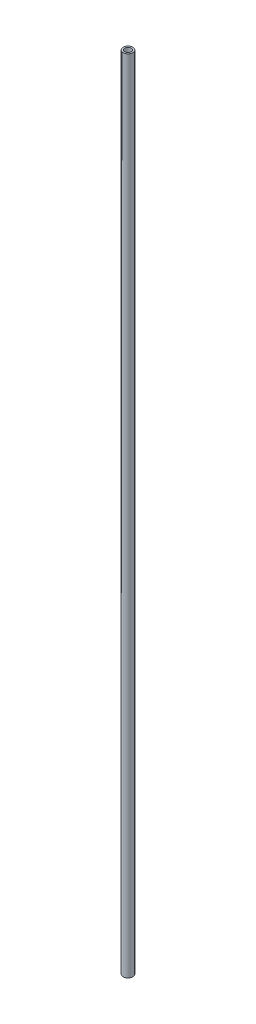
ISO-10303-21;
HEADER;
FILE_DESCRIPTION(('STEP AP214'),'2;1');
FILE_NAME('part.step','',(''),(''),'','','');
FILE_SCHEMA(('AUTOMOTIVE_DESIGN { 1 0 10303 214 1 1 1 1 }'));
ENDSEC;
DATA;
#1=APPLICATION_CONTEXT('core data for automotive mechanical design processes');
#2=APPLICATION_PROTOCOL_DEFINITION('international standard','automotive_design',2000,#1);
#3=PRODUCT_CONTEXT('',#1,'mechanical');
#4=PRODUCT('Part','Part','',(#3));
#5=PRODUCT_RELATED_PRODUCT_CATEGORY('part','',(#4));
#6=PRODUCT_DEFINITION_FORMATION('','',#4);
#7=PRODUCT_DEFINITION_CONTEXT('part definition',#1,'design');
#8=PRODUCT_DEFINITION('design','',#6,#7);
#9=PRODUCT_DEFINITION_SHAPE('','',#8);
#10=(LENGTH_UNIT() NAMED_UNIT(*) SI_UNIT(.MILLI.,.METRE.));
#11=(NAMED_UNIT(*) PLANE_ANGLE_UNIT() SI_UNIT($,.RADIAN.));
#12=(NAMED_UNIT(*) SI_UNIT($,.STERADIAN.) SOLID_ANGLE_UNIT());
#13=UNCERTAINTY_MEASURE_WITH_UNIT(LENGTH_MEASURE(1.E-05),#10,'distance_accuracy_value','');
#14=(GEOMETRIC_REPRESENTATION_CONTEXT(3) GLOBAL_UNCERTAINTY_ASSIGNED_CONTEXT((#13)) GLOBAL_UNIT_ASSIGNED_CONTEXT((#10,
#11,#12)) REPRESENTATION_CONTEXT('',''));
#15=CARTESIAN_POINT('',(0.,0.,0.));
#16=DIRECTION('',(0.,0.,1.));
#17=DIRECTION('',(1.,0.,0.));
#18=AXIS2_PLACEMENT_3D('',#15,#16,#17);
#19=CARTESIAN_POINT('',(0.,250.,0.));
#20=DIRECTION('',(0.,1.,0.));
#21=DIRECTION('',(0.,0.,1.));
#22=AXIS2_PLACEMENT_3D('',#19,#20,#21);
#23=PLANE('',#22);
#24=CARTESIAN_POINT('',(0.,250.,0.));
#25=DIRECTION('',(0.,1.,0.));
#26=DIRECTION('',(0.,0.,1.));
#27=AXIS2_PLACEMENT_3D('',#24,#25,#26);
#28=CIRCLE('',#27,3.);
#29=CARTESIAN_POINT('',(0.,250.,3.));
#30=VERTEX_POINT('',#29);
#31=EDGE_CURVE('E10',#30,#30,#28,.T.);
#32=ORIENTED_EDGE('',*,*,#31,.T.);
#33=EDGE_LOOP('',(#32));
#34=FACE_BOUND('',#33,.T.);
#35=CARTESIAN_POINT('',(0.,250.,0.));
#36=DIRECTION('',(0.,1.,0.));
#37=DIRECTION('',(0.,0.,1.));
#38=AXIS2_PLACEMENT_3D('',#35,#36,#37);
#39=CIRCLE('',#38,2.);
#40=CARTESIAN_POINT('',(0.,250.,2.));
#41=VERTEX_POINT('',#40);
#42=EDGE_CURVE('E42',#41,#41,#39,.T.);
#43=ORIENTED_EDGE('',*,*,#42,.F.);
#44=EDGE_LOOP('',(#43));
#45=FACE_BOUND('',#44,.T.);
#46=ADVANCED_FACE('F31',(#34,#45),#23,.T.);
#47=CARTESIAN_POINT('',(0.,-250.,0.));
#48=DIRECTION('',(0.,1.,0.));
#49=DIRECTION('',(0.,0.,1.));
#50=AXIS2_PLACEMENT_3D('',#47,#48,#49);
#51=PLANE('',#50);
#52=CARTESIAN_POINT('',(0.,-250.,0.));
#53=DIRECTION('',(0.,1.,0.));
#54=DIRECTION('',(0.,0.,1.));
#55=AXIS2_PLACEMENT_3D('',#52,#53,#54);
#56=CIRCLE('',#55,3.);
#57=CARTESIAN_POINT('',(0.,-250.,3.));
#58=VERTEX_POINT('',#57);
#59=EDGE_CURVE('E35',#58,#58,#56,.T.);
#60=ORIENTED_EDGE('',*,*,#59,.F.);
#61=EDGE_LOOP('',(#60));
#62=FACE_BOUND('',#61,.T.);
#63=CARTESIAN_POINT('',(0.,-250.,0.));
#64=DIRECTION('',(0.,1.,0.));
#65=DIRECTION('',(0.,0.,1.));
#66=AXIS2_PLACEMENT_3D('',#63,#64,#65);
#67=CIRCLE('',#66,2.);
#68=CARTESIAN_POINT('',(0.,-250.,2.));
#69=VERTEX_POINT('',#68);
#70=EDGE_CURVE('E44',#69,#69,#67,.T.);
#71=ORIENTED_EDGE('',*,*,#70,.T.);
#72=EDGE_LOOP('',(#71));
#73=FACE_BOUND('',#72,.T.);
#74=ADVANCED_FACE('F54',(#62,#73),#51,.F.);
#75=CARTESIAN_POINT('',(0.,250.,0.));
#76=DIRECTION('',(0.,-1.,0.));
#77=DIRECTION('',(0.,0.,-1.));
#78=AXIS2_PLACEMENT_3D('',#75,#76,#77);
#79=CYLINDRICAL_SURFACE('',#78,3.);
#80=ORIENTED_EDGE('',*,*,#31,.F.);
#81=EDGE_LOOP('',(#80));
#82=FACE_BOUND('',#81,.T.);
#83=ORIENTED_EDGE('',*,*,#59,.T.);
#84=EDGE_LOOP('',(#83));
#85=FACE_BOUND('',#84,.T.);
#86=ADVANCED_FACE('F33',(#82,#85),#79,.T.);
#87=CARTESIAN_POINT('',(0.,250.,0.));
#88=DIRECTION('',(0.,-1.,0.));
#89=DIRECTION('',(0.,0.,-1.));
#90=AXIS2_PLACEMENT_3D('',#87,#88,#89);
#91=CYLINDRICAL_SURFACE('',#90,2.);
#92=ORIENTED_EDGE('',*,*,#42,.T.);
#93=EDGE_LOOP('',(#92));
#94=FACE_BOUND('',#93,.T.);
#95=ORIENTED_EDGE('',*,*,#70,.F.);
#96=EDGE_LOOP('',(#95));
#97=FACE_BOUND('',#96,.T.);
#98=ADVANCED_FACE('F50',(#94,#97),#91,.F.);
#99=CLOSED_SHELL('',(#46,#74,#86,#98));
#100=MANIFOLD_SOLID_BREP('B2',#99);
#101=ADVANCED_BREP_SHAPE_REPRESENTATION('',(#18,#100),#14);
#102=SHAPE_DEFINITION_REPRESENTATION(#9,#101);
ENDSEC;
END-ISO-10303-21;
